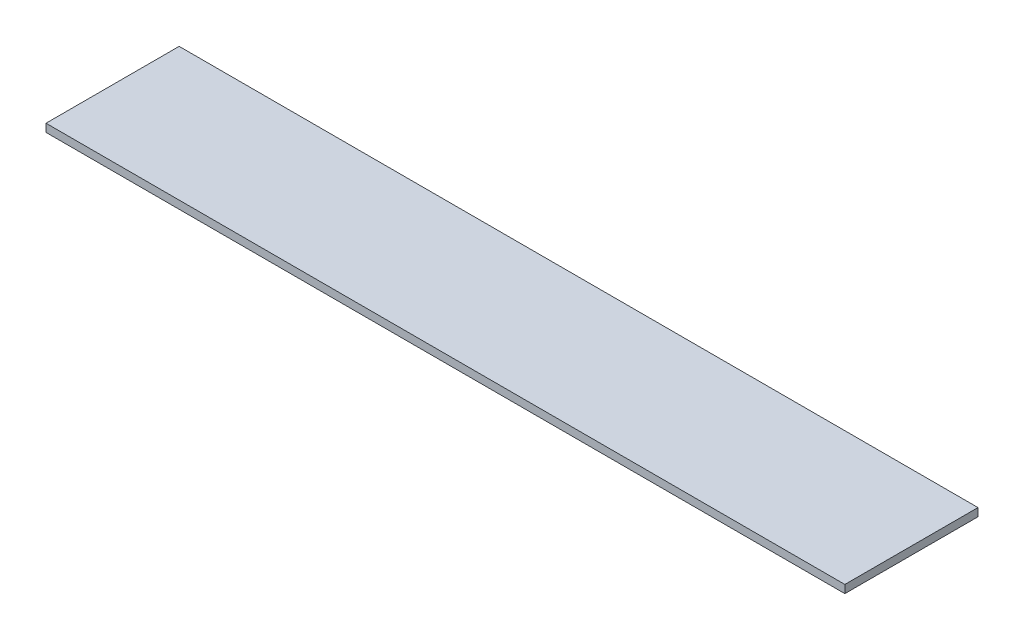
ISO-10303-21;
HEADER;
FILE_DESCRIPTION(('STEP AP214'),'2;1');
FILE_NAME('part.step','',(''),(''),'','','');
FILE_SCHEMA(('AUTOMOTIVE_DESIGN { 1 0 10303 214 1 1 1 1 }'));
ENDSEC;
DATA;
#1=APPLICATION_CONTEXT('core data for automotive mechanical design processes');
#2=APPLICATION_PROTOCOL_DEFINITION('international standard','automotive_design',2000,#1);
#3=PRODUCT_CONTEXT('',#1,'mechanical');
#4=PRODUCT('Part','Part','',(#3));
#5=PRODUCT_RELATED_PRODUCT_CATEGORY('part','',(#4));
#6=PRODUCT_DEFINITION_FORMATION('','',#4);
#7=PRODUCT_DEFINITION_CONTEXT('part definition',#1,'design');
#8=PRODUCT_DEFINITION('design','',#6,#7);
#9=PRODUCT_DEFINITION_SHAPE('','',#8);
#10=(LENGTH_UNIT() NAMED_UNIT(*) SI_UNIT(.MILLI.,.METRE.));
#11=(NAMED_UNIT(*) PLANE_ANGLE_UNIT() SI_UNIT($,.RADIAN.));
#12=(NAMED_UNIT(*) SI_UNIT($,.STERADIAN.) SOLID_ANGLE_UNIT());
#13=UNCERTAINTY_MEASURE_WITH_UNIT(LENGTH_MEASURE(1.E-05),#10,'distance_accuracy_value','');
#14=(GEOMETRIC_REPRESENTATION_CONTEXT(3) GLOBAL_UNCERTAINTY_ASSIGNED_CONTEXT((#13)) GLOBAL_UNIT_ASSIGNED_CONTEXT((#10,
#11,#12)) REPRESENTATION_CONTEXT('',''));
#15=CARTESIAN_POINT('',(0.,0.,0.));
#16=DIRECTION('',(0.,0.,1.));
#17=DIRECTION('',(1.,0.,0.));
#18=AXIS2_PLACEMENT_3D('',#15,#16,#17);
#19=CARTESIAN_POINT('',(150.,3.,-25.));
#20=DIRECTION('',(-1.,0.,0.));
#21=DIRECTION('',(0.,0.,1.));
#22=AXIS2_PLACEMENT_3D('',#19,#20,#21);
#23=PLANE('',#22);
#24=DIRECTION('',(0.,0.,-1.));
#25=VECTOR('',#24,1.);
#26=CARTESIAN_POINT('',(150.,0.,-25.));
#27=LINE('',#26,#25);
#28=CARTESIAN_POINT('',(150.,0.,25.));
#29=VERTEX_POINT('',#28);
#30=CARTESIAN_POINT('',(150.,0.,-25.));
#31=VERTEX_POINT('',#30);
#32=EDGE_CURVE('E98',#29,#31,#27,.T.);
#33=ORIENTED_EDGE('',*,*,#32,.T.);
#34=DIRECTION('',(0.,-1.,0.));
#35=VECTOR('',#34,1.);
#36=CARTESIAN_POINT('',(150.,3.,-25.));
#37=LINE('',#36,#35);
#38=CARTESIAN_POINT('',(150.,3.,-25.));
#39=VERTEX_POINT('',#38);
#40=EDGE_CURVE('E11',#39,#31,#37,.T.);
#41=ORIENTED_EDGE('',*,*,#40,.F.);
#42=DIRECTION('',(0.,0.,-1.));
#43=VECTOR('',#42,1.);
#44=CARTESIAN_POINT('',(150.,3.,-25.));
#45=LINE('',#44,#43);
#46=CARTESIAN_POINT('',(150.,3.,25.));
#47=VERTEX_POINT('',#46);
#48=EDGE_CURVE('E86',#47,#39,#45,.T.);
#49=ORIENTED_EDGE('',*,*,#48,.F.);
#50=DIRECTION('',(0.,-1.,0.));
#51=VECTOR('',#50,1.);
#52=CARTESIAN_POINT('',(150.,3.,25.));
#53=LINE('',#52,#51);
#54=EDGE_CURVE('E94',#47,#29,#53,.T.);
#55=ORIENTED_EDGE('',*,*,#54,.T.);
#56=EDGE_LOOP('',(#33,#41,#49,#55));
#57=FACE_BOUND('',#56,.T.);
#58=ADVANCED_FACE('F35',(#57),#23,.F.);
#59=CARTESIAN_POINT('',(-150.,3.,-25.));
#60=DIRECTION('',(0.,0.,1.));
#61=DIRECTION('',(1.,0.,0.));
#62=AXIS2_PLACEMENT_3D('',#59,#60,#61);
#63=PLANE('',#62);
#64=DIRECTION('',(-1.,0.,0.));
#65=VECTOR('',#64,1.);
#66=CARTESIAN_POINT('',(-150.,0.,-25.));
#67=LINE('',#66,#65);
#68=CARTESIAN_POINT('',(-150.,0.,-25.));
#69=VERTEX_POINT('',#68);
#70=EDGE_CURVE('E90',#31,#69,#67,.T.);
#71=ORIENTED_EDGE('',*,*,#70,.T.);
#72=DIRECTION('',(0.,-1.,0.));
#73=VECTOR('',#72,1.);
#74=CARTESIAN_POINT('',(-150.,3.,-25.));
#75=LINE('',#74,#73);
#76=CARTESIAN_POINT('',(-150.,3.,-25.));
#77=VERTEX_POINT('',#76);
#78=EDGE_CURVE('E43',#77,#69,#75,.T.);
#79=ORIENTED_EDGE('',*,*,#78,.F.);
#80=DIRECTION('',(-1.,0.,0.));
#81=VECTOR('',#80,1.);
#82=CARTESIAN_POINT('',(-150.,3.,-25.));
#83=LINE('',#82,#81);
#84=EDGE_CURVE('E81',#39,#77,#83,.T.);
#85=ORIENTED_EDGE('',*,*,#84,.F.);
#86=ORIENTED_EDGE('',*,*,#40,.T.);
#87=EDGE_LOOP('',(#71,#79,#85,#86));
#88=FACE_BOUND('',#87,.T.);
#89=ADVANCED_FACE('F89',(#88),#63,.F.);
#90=CARTESIAN_POINT('',(-150.,3.,-25.));
#91=DIRECTION('',(1.,0.,0.));
#92=DIRECTION('',(0.,0.,-1.));
#93=AXIS2_PLACEMENT_3D('',#90,#91,#92);
#94=PLANE('',#93);
#95=DIRECTION('',(0.,0.,1.));
#96=VECTOR('',#95,1.);
#97=CARTESIAN_POINT('',(-150.,0.,-25.));
#98=LINE('',#97,#96);
#99=CARTESIAN_POINT('',(-150.,0.,25.));
#100=VERTEX_POINT('',#99);
#101=EDGE_CURVE('E68',#69,#100,#98,.T.);
#102=ORIENTED_EDGE('',*,*,#101,.T.);
#103=DIRECTION('',(0.,-1.,0.));
#104=VECTOR('',#103,1.);
#105=CARTESIAN_POINT('',(-150.,3.,25.));
#106=LINE('',#105,#104);
#107=CARTESIAN_POINT('',(-150.,3.,25.));
#108=VERTEX_POINT('',#107);
#109=EDGE_CURVE('E91',#108,#100,#106,.T.);
#110=ORIENTED_EDGE('',*,*,#109,.F.);
#111=DIRECTION('',(0.,0.,1.));
#112=VECTOR('',#111,1.);
#113=CARTESIAN_POINT('',(-150.,3.,-25.));
#114=LINE('',#113,#112);
#115=EDGE_CURVE('E84',#77,#108,#114,.T.);
#116=ORIENTED_EDGE('',*,*,#115,.F.);
#117=ORIENTED_EDGE('',*,*,#78,.T.);
#118=EDGE_LOOP('',(#102,#110,#116,#117));
#119=FACE_BOUND('',#118,.T.);
#120=ADVANCED_FACE('F92',(#119),#94,.F.);
#121=CARTESIAN_POINT('',(-150.,3.,25.));
#122=DIRECTION('',(0.,0.,-1.));
#123=DIRECTION('',(-1.,0.,0.));
#124=AXIS2_PLACEMENT_3D('',#121,#122,#123);
#125=PLANE('',#124);
#126=DIRECTION('',(1.,0.,0.));
#127=VECTOR('',#126,1.);
#128=CARTESIAN_POINT('',(-150.,0.,25.));
#129=LINE('',#128,#127);
#130=EDGE_CURVE('E74',#100,#29,#129,.T.);
#131=ORIENTED_EDGE('',*,*,#130,.T.);
#132=ORIENTED_EDGE('',*,*,#54,.F.);
#133=DIRECTION('',(1.,0.,0.));
#134=VECTOR('',#133,1.);
#135=CARTESIAN_POINT('',(-150.,3.,25.));
#136=LINE('',#135,#134);
#137=EDGE_CURVE('E51',#108,#47,#136,.T.);
#138=ORIENTED_EDGE('',*,*,#137,.F.);
#139=ORIENTED_EDGE('',*,*,#109,.T.);
#140=EDGE_LOOP('',(#131,#132,#138,#139));
#141=FACE_BOUND('',#140,.T.);
#142=ADVANCED_FACE('F105',(#141),#125,.F.);
#143=CARTESIAN_POINT('',(0.,3.,0.));
#144=DIRECTION('',(0.,1.,0.));
#145=DIRECTION('',(0.,0.,1.));
#146=AXIS2_PLACEMENT_3D('',#143,#144,#145);
#147=PLANE('',#146);
#148=ORIENTED_EDGE('',*,*,#48,.T.);
#149=ORIENTED_EDGE('',*,*,#84,.T.);
#150=ORIENTED_EDGE('',*,*,#115,.T.);
#151=ORIENTED_EDGE('',*,*,#137,.T.);
#152=EDGE_LOOP('',(#148,#149,#150,#151));
#153=FACE_BOUND('',#152,.T.);
#154=ADVANCED_FACE('F82',(#153),#147,.T.);
#155=CARTESIAN_POINT('',(0.,0.,0.));
#156=DIRECTION('',(0.,1.,0.));
#157=DIRECTION('',(0.,0.,1.));
#158=AXIS2_PLACEMENT_3D('',#155,#156,#157);
#159=PLANE('',#158);
#160=ORIENTED_EDGE('',*,*,#32,.F.);
#161=ORIENTED_EDGE('',*,*,#130,.F.);
#162=ORIENTED_EDGE('',*,*,#101,.F.);
#163=ORIENTED_EDGE('',*,*,#70,.F.);
#164=EDGE_LOOP('',(#160,#161,#162,#163));
#165=FACE_BOUND('',#164,.T.);
#166=ADVANCED_FACE('F108',(#165),#159,.F.);
#167=CLOSED_SHELL('',(#58,#89,#120,#142,#154,#166));
#168=MANIFOLD_SOLID_BREP('B2',#167);
#169=ADVANCED_BREP_SHAPE_REPRESENTATION('',(#18,#168),#14);
#170=SHAPE_DEFINITION_REPRESENTATION(#9,#169);
ENDSEC;
END-ISO-10303-21;
